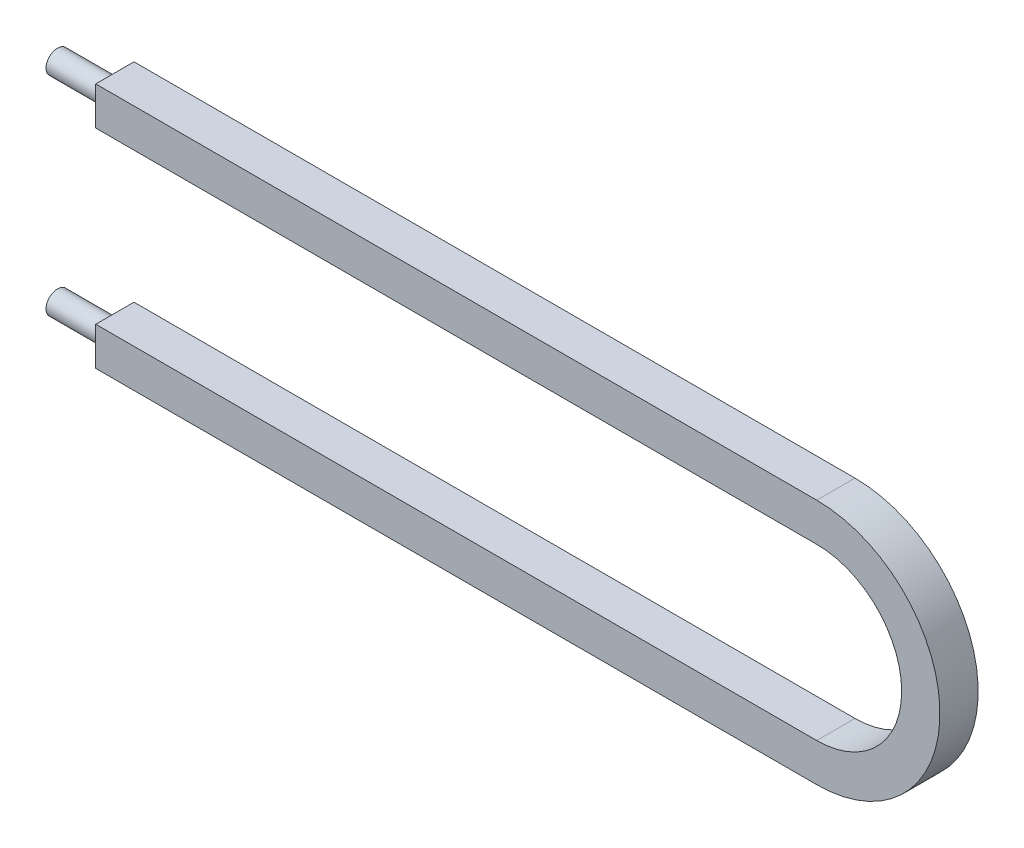
ISO-10303-21;
HEADER;
FILE_DESCRIPTION(('STEP AP214'),'2;1');
FILE_NAME('part.step','',(''),(''),'','','');
FILE_SCHEMA(('AUTOMOTIVE_DESIGN { 1 0 10303 214 1 1 1 1 }'));
ENDSEC;
DATA;
#1=APPLICATION_CONTEXT('core data for automotive mechanical design processes');
#2=APPLICATION_PROTOCOL_DEFINITION('international standard','automotive_design',2000,#1);
#3=PRODUCT_CONTEXT('',#1,'mechanical');
#4=PRODUCT('Part','Part','',(#3));
#5=PRODUCT_RELATED_PRODUCT_CATEGORY('part','',(#4));
#6=PRODUCT_DEFINITION_FORMATION('','',#4);
#7=PRODUCT_DEFINITION_CONTEXT('part definition',#1,'design');
#8=PRODUCT_DEFINITION('design','',#6,#7);
#9=PRODUCT_DEFINITION_SHAPE('','',#8);
#10=(LENGTH_UNIT() NAMED_UNIT(*) SI_UNIT(.MILLI.,.METRE.));
#11=(NAMED_UNIT(*) PLANE_ANGLE_UNIT() SI_UNIT($,.RADIAN.));
#12=(NAMED_UNIT(*) SI_UNIT($,.STERADIAN.) SOLID_ANGLE_UNIT());
#13=UNCERTAINTY_MEASURE_WITH_UNIT(LENGTH_MEASURE(1.E-05),#10,'distance_accuracy_value','');
#14=(GEOMETRIC_REPRESENTATION_CONTEXT(3) GLOBAL_UNCERTAINTY_ASSIGNED_CONTEXT((#13)) GLOBAL_UNIT_ASSIGNED_CONTEXT((#10,
#11,#12)) REPRESENTATION_CONTEXT('',''));
#15=CARTESIAN_POINT('',(0.,0.,0.));
#16=DIRECTION('',(0.,0.,1.));
#17=DIRECTION('',(1.,0.,0.));
#18=AXIS2_PLACEMENT_3D('',#15,#16,#17);
#19=CARTESIAN_POINT('',(0.,-10.,10.));
#20=DIRECTION('',(1.,0.,0.));
#21=DIRECTION('',(0.,0.,-1.));
#22=AXIS2_PLACEMENT_3D('',#19,#20,#21);
#23=PLANE('',#22);
#24=CARTESIAN_POINT('',(0.,-4.90697990871341,5.));
#25=DIRECTION('',(1.,0.,0.));
#26=DIRECTION('',(0.,0.,-1.));
#27=AXIS2_PLACEMENT_3D('',#24,#25,#26);
#28=CIRCLE('',#27,3.);
#29=CARTESIAN_POINT('',(0.,-4.90697990871341,2.));
#30=VERTEX_POINT('',#29);
#31=EDGE_CURVE('E45',#30,#30,#28,.F.);
#32=ORIENTED_EDGE('',*,*,#31,.F.);
#33=EDGE_LOOP('',(#32));
#34=FACE_BOUND('',#33,.T.);
#35=DIRECTION('',(0.,-1.,0.));
#36=VECTOR('',#35,1.);
#37=CARTESIAN_POINT('',(0.,-10.,0.));
#38=LINE('',#37,#36);
#39=CARTESIAN_POINT('',(0.,0.,0.));
#40=VERTEX_POINT('',#39);
#41=CARTESIAN_POINT('',(0.,-10.,0.));
#42=VERTEX_POINT('',#41);
#43=EDGE_CURVE('E134',#40,#42,#38,.T.);
#44=ORIENTED_EDGE('',*,*,#43,.T.);
#45=DIRECTION('',(0.,0.,-1.));
#46=VECTOR('',#45,1.);
#47=CARTESIAN_POINT('',(0.,-10.,10.));
#48=LINE('',#47,#46);
#49=CARTESIAN_POINT('',(0.,-10.,10.));
#50=VERTEX_POINT('',#49);
#51=EDGE_CURVE('E162',#50,#42,#48,.T.);
#52=ORIENTED_EDGE('',*,*,#51,.F.);
#53=DIRECTION('',(0.,-1.,0.));
#54=VECTOR('',#53,1.);
#55=CARTESIAN_POINT('',(0.,-10.,10.));
#56=LINE('',#55,#54);
#57=CARTESIAN_POINT('',(0.,0.,10.));
#58=VERTEX_POINT('',#57);
#59=EDGE_CURVE('E149',#58,#50,#56,.T.);
#60=ORIENTED_EDGE('',*,*,#59,.F.);
#61=DIRECTION('',(0.,0.,-1.));
#62=VECTOR('',#61,1.);
#63=CARTESIAN_POINT('',(0.,0.,10.));
#64=LINE('',#63,#62);
#65=EDGE_CURVE('E130',#58,#40,#64,.T.);
#66=ORIENTED_EDGE('',*,*,#65,.T.);
#67=EDGE_LOOP('',(#44,#52,#60,#66));
#68=FACE_BOUND('',#67,.T.);
#69=ADVANCED_FACE('F37',(#34,#68),#23,.F.);
#70=CARTESIAN_POINT('',(0.,-10.,10.));
#71=DIRECTION('',(0.,1.,0.));
#72=DIRECTION('',(0.,0.,1.));
#73=AXIS2_PLACEMENT_3D('',#70,#71,#72);
#74=PLANE('',#73);
#75=DIRECTION('',(1.,0.,0.));
#76=VECTOR('',#75,1.);
#77=CARTESIAN_POINT('',(0.,-10.,0.));
#78=LINE('',#77,#76);
#79=CARTESIAN_POINT('',(188.467924538912,-10.,0.));
#80=VERTEX_POINT('',#79);
#81=EDGE_CURVE('E137',#42,#80,#78,.T.);
#82=ORIENTED_EDGE('',*,*,#81,.T.);
#83=DIRECTION('',(0.,0.,-1.));
#84=VECTOR('',#83,1.);
#85=CARTESIAN_POINT('',(188.467924538912,-10.,10.));
#86=LINE('',#85,#84);
#87=CARTESIAN_POINT('',(188.467924538912,-10.,10.));
#88=VERTEX_POINT('',#87);
#89=EDGE_CURVE('E159',#88,#80,#86,.T.);
#90=ORIENTED_EDGE('',*,*,#89,.F.);
#91=DIRECTION('',(1.,0.,0.));
#92=VECTOR('',#91,1.);
#93=CARTESIAN_POINT('',(0.,-10.,10.));
#94=LINE('',#93,#92);
#95=EDGE_CURVE('E97',#50,#88,#94,.T.);
#96=ORIENTED_EDGE('',*,*,#95,.F.);
#97=ORIENTED_EDGE('',*,*,#51,.T.);
#98=EDGE_LOOP('',(#82,#90,#96,#97));
#99=FACE_BOUND('',#98,.T.);
#100=ADVANCED_FACE('F170',(#99),#74,.F.);
#101=CARTESIAN_POINT('',(188.467924538912,-32.2048422230386,10.));
#102=DIRECTION('',(0.,0.,-1.));
#103=DIRECTION('',(-1.,0.,0.));
#104=AXIS2_PLACEMENT_3D('',#101,#102,#103);
#105=CYLINDRICAL_SURFACE('',#104,22.2048422230386);
#106=CARTESIAN_POINT('',(188.467924538912,-32.2048422230386,0.));
#107=DIRECTION('',(0.,0.,-1.));
#108=DIRECTION('',(-1.,0.,0.));
#109=AXIS2_PLACEMENT_3D('',#106,#107,#108);
#110=CIRCLE('',#109,22.2048422230386);
#111=CARTESIAN_POINT('',(188.467924538912,-54.4096844460773,0.));
#112=VERTEX_POINT('',#111);
#113=EDGE_CURVE('E140',#80,#112,#110,.T.);
#114=ORIENTED_EDGE('',*,*,#113,.T.);
#115=DIRECTION('',(0.,0.,-1.));
#116=VECTOR('',#115,1.);
#117=CARTESIAN_POINT('',(188.467924538912,-54.4096844460773,10.));
#118=LINE('',#117,#116);
#119=CARTESIAN_POINT('',(188.467924538912,-54.4096844460773,10.));
#120=VERTEX_POINT('',#119);
#121=EDGE_CURVE('E156',#120,#112,#118,.T.);
#122=ORIENTED_EDGE('',*,*,#121,.F.);
#123=CARTESIAN_POINT('',(188.467924538912,-32.2048422230386,10.));
#124=DIRECTION('',(0.,0.,-1.));
#125=DIRECTION('',(-1.,0.,0.));
#126=AXIS2_PLACEMENT_3D('',#123,#124,#125);
#127=CIRCLE('',#126,22.2048422230386);
#128=EDGE_CURVE('E230',#88,#120,#127,.T.);
#129=ORIENTED_EDGE('',*,*,#128,.F.);
#130=ORIENTED_EDGE('',*,*,#89,.T.);
#131=EDGE_LOOP('',(#114,#122,#129,#130));
#132=FACE_BOUND('',#131,.T.);
#133=ADVANCED_FACE('F179',(#132),#105,.F.);
#134=CARTESIAN_POINT('',(188.467924538912,-54.4096844460773,10.));
#135=DIRECTION('',(0.,-1.,0.));
#136=DIRECTION('',(0.,0.,-1.));
#137=AXIS2_PLACEMENT_3D('',#134,#135,#136);
#138=PLANE('',#137);
#139=DIRECTION('',(-1.,0.,0.));
#140=VECTOR('',#139,1.);
#141=CARTESIAN_POINT('',(188.467924538912,-54.4096844460773,0.));
#142=LINE('',#141,#140);
#143=CARTESIAN_POINT('',(0.,-54.4096844460773,0.));
#144=VERTEX_POINT('',#143);
#145=EDGE_CURVE('E142',#112,#144,#142,.T.);
#146=ORIENTED_EDGE('',*,*,#145,.T.);
#147=DIRECTION('',(0.,0.,-1.));
#148=VECTOR('',#147,1.);
#149=CARTESIAN_POINT('',(0.,-54.4096844460773,10.));
#150=LINE('',#149,#148);
#151=CARTESIAN_POINT('',(0.,-54.4096844460773,10.));
#152=VERTEX_POINT('',#151);
#153=EDGE_CURVE('E153',#152,#144,#150,.T.);
#154=ORIENTED_EDGE('',*,*,#153,.F.);
#155=DIRECTION('',(-1.,0.,0.));
#156=VECTOR('',#155,1.);
#157=CARTESIAN_POINT('',(188.467924538912,-54.4096844460773,10.));
#158=LINE('',#157,#156);
#159=EDGE_CURVE('E232',#120,#152,#158,.T.);
#160=ORIENTED_EDGE('',*,*,#159,.F.);
#161=ORIENTED_EDGE('',*,*,#121,.T.);
#162=EDGE_LOOP('',(#146,#154,#160,#161));
#163=FACE_BOUND('',#162,.T.);
#164=ADVANCED_FACE('F183',(#163),#138,.F.);
#165=CARTESIAN_POINT('',(0.,-54.4096844460773,10.));
#166=DIRECTION('',(1.,0.,0.));
#167=DIRECTION('',(0.,0.,-1.));
#168=AXIS2_PLACEMENT_3D('',#165,#166,#167);
#169=PLANE('',#168);
#170=CARTESIAN_POINT('',(0.,-59.4096844460773,5.));
#171=DIRECTION('',(1.,0.,0.));
#172=DIRECTION('',(0.,0.,-1.));
#173=AXIS2_PLACEMENT_3D('',#170,#171,#172);
#174=CIRCLE('',#173,3.);
#175=CARTESIAN_POINT('',(0.,-59.4096844460773,2.));
#176=VERTEX_POINT('',#175);
#177=EDGE_CURVE('E11',#176,#176,#174,.F.);
#178=ORIENTED_EDGE('',*,*,#177,.F.);
#179=EDGE_LOOP('',(#178));
#180=FACE_BOUND('',#179,.T.);
#181=DIRECTION('',(0.,-1.,0.));
#182=VECTOR('',#181,1.);
#183=CARTESIAN_POINT('',(0.,-54.4096844460773,0.));
#184=LINE('',#183,#182);
#185=CARTESIAN_POINT('',(0.,-64.4096844460773,0.));
#186=VERTEX_POINT('',#185);
#187=EDGE_CURVE('E144',#144,#186,#184,.T.);
#188=ORIENTED_EDGE('',*,*,#187,.T.);
#189=DIRECTION('',(0.,0.,-1.));
#190=VECTOR('',#189,1.);
#191=CARTESIAN_POINT('',(0.,-64.4096844460773,10.));
#192=LINE('',#191,#190);
#193=CARTESIAN_POINT('',(0.,-64.4096844460773,10.));
#194=VERTEX_POINT('',#193);
#195=EDGE_CURVE('E125',#194,#186,#192,.T.);
#196=ORIENTED_EDGE('',*,*,#195,.F.);
#197=DIRECTION('',(0.,-1.,0.));
#198=VECTOR('',#197,1.);
#199=CARTESIAN_POINT('',(0.,-54.4096844460773,10.));
#200=LINE('',#199,#198);
#201=EDGE_CURVE('E116',#152,#194,#200,.T.);
#202=ORIENTED_EDGE('',*,*,#201,.F.);
#203=ORIENTED_EDGE('',*,*,#153,.T.);
#204=EDGE_LOOP('',(#188,#196,#202,#203));
#205=FACE_BOUND('',#204,.T.);
#206=ADVANCED_FACE('F189',(#180,#205),#169,.F.);
#207=CARTESIAN_POINT('',(188.467924538912,-64.4096844460773,10.));
#208=DIRECTION('',(0.,1.,0.));
#209=DIRECTION('',(0.,0.,1.));
#210=AXIS2_PLACEMENT_3D('',#207,#208,#209);
#211=PLANE('',#210);
#212=DIRECTION('',(1.,0.,0.));
#213=VECTOR('',#212,1.);
#214=CARTESIAN_POINT('',(188.467924538912,-64.4096844460773,0.));
#215=LINE('',#214,#213);
#216=CARTESIAN_POINT('',(188.467924538912,-64.4096844460773,0.));
#217=VERTEX_POINT('',#216);
#218=EDGE_CURVE('E124',#186,#217,#215,.T.);
#219=ORIENTED_EDGE('',*,*,#218,.T.);
#220=DIRECTION('',(0.,0.,-1.));
#221=VECTOR('',#220,1.);
#222=CARTESIAN_POINT('',(188.467924538912,-64.4096844460773,10.));
#223=LINE('',#222,#221);
#224=CARTESIAN_POINT('',(188.467924538912,-64.4096844460773,10.));
#225=VERTEX_POINT('',#224);
#226=EDGE_CURVE('E121',#225,#217,#223,.T.);
#227=ORIENTED_EDGE('',*,*,#226,.F.);
#228=DIRECTION('',(1.,0.,0.));
#229=VECTOR('',#228,1.);
#230=CARTESIAN_POINT('',(188.467924538912,-64.4096844460773,10.));
#231=LINE('',#230,#229);
#232=EDGE_CURVE('E110',#194,#225,#231,.T.);
#233=ORIENTED_EDGE('',*,*,#232,.F.);
#234=ORIENTED_EDGE('',*,*,#195,.T.);
#235=EDGE_LOOP('',(#219,#227,#233,#234));
#236=FACE_BOUND('',#235,.T.);
#237=ADVANCED_FACE('F122',(#236),#211,.F.);
#238=CARTESIAN_POINT('',(188.467924538912,-32.2048422230386,10.));
#239=DIRECTION('',(0.,0.,-1.));
#240=DIRECTION('',(-1.,0.,0.));
#241=AXIS2_PLACEMENT_3D('',#238,#239,#240);
#242=CYLINDRICAL_SURFACE('',#241,32.2048422230386);
#243=CARTESIAN_POINT('',(188.467924538912,-32.2048422230386,0.));
#244=DIRECTION('',(0.,0.,1.));
#245=DIRECTION('',(-1.,0.,0.));
#246=AXIS2_PLACEMENT_3D('',#243,#244,#245);
#247=CIRCLE('',#246,32.2048422230386);
#248=CARTESIAN_POINT('',(188.467924538912,0.,0.));
#249=VERTEX_POINT('',#248);
#250=EDGE_CURVE('E82',#217,#249,#247,.T.);
#251=ORIENTED_EDGE('',*,*,#250,.T.);
#252=DIRECTION('',(0.,0.,-1.));
#253=VECTOR('',#252,1.);
#254=CARTESIAN_POINT('',(188.467924538912,0.,10.));
#255=LINE('',#254,#253);
#256=CARTESIAN_POINT('',(188.467924538912,0.,10.));
#257=VERTEX_POINT('',#256);
#258=EDGE_CURVE('E126',#257,#249,#255,.T.);
#259=ORIENTED_EDGE('',*,*,#258,.F.);
#260=CARTESIAN_POINT('',(188.467924538912,-32.2048422230386,10.));
#261=DIRECTION('',(0.,0.,1.));
#262=DIRECTION('',(-1.,0.,0.));
#263=AXIS2_PLACEMENT_3D('',#260,#261,#262);
#264=CIRCLE('',#263,32.2048422230386);
#265=EDGE_CURVE('E114',#225,#257,#264,.T.);
#266=ORIENTED_EDGE('',*,*,#265,.F.);
#267=ORIENTED_EDGE('',*,*,#226,.T.);
#268=EDGE_LOOP('',(#251,#259,#266,#267));
#269=FACE_BOUND('',#268,.T.);
#270=ADVANCED_FACE('F128',(#269),#242,.T.);
#271=CARTESIAN_POINT('',(0.,0.,10.));
#272=DIRECTION('',(0.,-1.,0.));
#273=DIRECTION('',(0.,0.,-1.));
#274=AXIS2_PLACEMENT_3D('',#271,#272,#273);
#275=PLANE('',#274);
#276=DIRECTION('',(-1.,0.,0.));
#277=VECTOR('',#276,1.);
#278=CARTESIAN_POINT('',(0.,0.,0.));
#279=LINE('',#278,#277);
#280=EDGE_CURVE('E88',#249,#40,#279,.T.);
#281=ORIENTED_EDGE('',*,*,#280,.T.);
#282=ORIENTED_EDGE('',*,*,#65,.F.);
#283=DIRECTION('',(-1.,0.,0.));
#284=VECTOR('',#283,1.);
#285=CARTESIAN_POINT('',(0.,0.,10.));
#286=LINE('',#285,#284);
#287=EDGE_CURVE('E53',#257,#58,#286,.T.);
#288=ORIENTED_EDGE('',*,*,#287,.F.);
#289=ORIENTED_EDGE('',*,*,#258,.T.);
#290=EDGE_LOOP('',(#281,#282,#288,#289));
#291=FACE_BOUND('',#290,.T.);
#292=ADVANCED_FACE('F198',(#291),#275,.F.);
#293=CARTESIAN_POINT('',(188.467924538912,-32.2048422230386,10.));
#294=DIRECTION('',(0.,0.,-1.));
#295=DIRECTION('',(-1.,0.,0.));
#296=AXIS2_PLACEMENT_3D('',#293,#294,#295);
#297=PLANE('',#296);
#298=ORIENTED_EDGE('',*,*,#59,.T.);
#299=ORIENTED_EDGE('',*,*,#95,.T.);
#300=ORIENTED_EDGE('',*,*,#128,.T.);
#301=ORIENTED_EDGE('',*,*,#159,.T.);
#302=ORIENTED_EDGE('',*,*,#201,.T.);
#303=ORIENTED_EDGE('',*,*,#232,.T.);
#304=ORIENTED_EDGE('',*,*,#265,.T.);
#305=ORIENTED_EDGE('',*,*,#287,.T.);
#306=EDGE_LOOP('',(#298,#299,#300,#301,#302,#303,#304,#305));
#307=FACE_BOUND('',#306,.T.);
#308=ADVANCED_FACE('F112',(#307),#297,.F.);
#309=CARTESIAN_POINT('',(188.467924538912,-32.2048422230386,0.));
#310=DIRECTION('',(0.,0.,-1.));
#311=DIRECTION('',(-1.,0.,0.));
#312=AXIS2_PLACEMENT_3D('',#309,#310,#311);
#313=PLANE('',#312);
#314=ORIENTED_EDGE('',*,*,#43,.F.);
#315=ORIENTED_EDGE('',*,*,#280,.F.);
#316=ORIENTED_EDGE('',*,*,#250,.F.);
#317=ORIENTED_EDGE('',*,*,#218,.F.);
#318=ORIENTED_EDGE('',*,*,#187,.F.);
#319=ORIENTED_EDGE('',*,*,#145,.F.);
#320=ORIENTED_EDGE('',*,*,#113,.F.);
#321=ORIENTED_EDGE('',*,*,#81,.F.);
#322=EDGE_LOOP('',(#314,#315,#316,#317,#318,#319,#320,#321));
#323=FACE_BOUND('',#322,.T.);
#324=ADVANCED_FACE('F175',(#323),#313,.T.);
#325=CARTESIAN_POINT('',(-15.,-4.90697990871341,5.));
#326=DIRECTION('',(1.,0.,0.));
#327=DIRECTION('',(0.,0.,-1.));
#328=AXIS2_PLACEMENT_3D('',#325,#326,#327);
#329=CYLINDRICAL_SURFACE('',#328,3.);
#330=CARTESIAN_POINT('',(-15.,-4.90697990871341,5.));
#331=DIRECTION('',(-1.,0.,0.));
#332=DIRECTION('',(0.,0.,1.));
#333=AXIS2_PLACEMENT_3D('',#330,#331,#332);
#334=CIRCLE('',#333,3.);
#335=CARTESIAN_POINT('',(-15.,-4.90697990871341,8.));
#336=VERTEX_POINT('',#335);
#337=EDGE_CURVE('E138',#336,#336,#334,.T.);
#338=ORIENTED_EDGE('',*,*,#337,.F.);
#339=EDGE_LOOP('',(#338));
#340=FACE_BOUND('',#339,.T.);
#341=ORIENTED_EDGE('',*,*,#31,.T.);
#342=EDGE_LOOP('',(#341));
#343=FACE_BOUND('',#342,.T.);
#344=ADVANCED_FACE('F166',(#340,#343),#329,.T.);
#345=CARTESIAN_POINT('',(-15.,-4.90697990871341,5.));
#346=DIRECTION('',(-1.,0.,0.));
#347=DIRECTION('',(0.,0.,1.));
#348=AXIS2_PLACEMENT_3D('',#345,#346,#347);
#349=PLANE('',#348);
#350=ORIENTED_EDGE('',*,*,#337,.T.);
#351=EDGE_LOOP('',(#350));
#352=FACE_BOUND('',#351,.T.);
#353=ADVANCED_FACE('F207',(#352),#349,.T.);
#354=CARTESIAN_POINT('',(-15.,-59.4096844460773,5.));
#355=DIRECTION('',(1.,0.,0.));
#356=DIRECTION('',(0.,0.,-1.));
#357=AXIS2_PLACEMENT_3D('',#354,#355,#356);
#358=CYLINDRICAL_SURFACE('',#357,3.);
#359=CARTESIAN_POINT('',(-15.,-59.4096844460773,5.));
#360=DIRECTION('',(-1.,0.,0.));
#361=DIRECTION('',(0.,0.,1.));
#362=AXIS2_PLACEMENT_3D('',#359,#360,#361);
#363=CIRCLE('',#362,3.);
#364=CARTESIAN_POINT('',(-15.,-59.4096844460773,8.));
#365=VERTEX_POINT('',#364);
#366=EDGE_CURVE('E223',#365,#365,#363,.T.);
#367=ORIENTED_EDGE('',*,*,#366,.F.);
#368=EDGE_LOOP('',(#367));
#369=FACE_BOUND('',#368,.T.);
#370=ORIENTED_EDGE('',*,*,#177,.T.);
#371=EDGE_LOOP('',(#370));
#372=FACE_BOUND('',#371,.T.);
#373=ADVANCED_FACE('F211',(#369,#372),#358,.T.);
#374=CARTESIAN_POINT('',(-15.,-59.4096844460773,5.));
#375=DIRECTION('',(-1.,0.,0.));
#376=DIRECTION('',(0.,0.,1.));
#377=AXIS2_PLACEMENT_3D('',#374,#375,#376);
#378=PLANE('',#377);
#379=ORIENTED_EDGE('',*,*,#366,.T.);
#380=EDGE_LOOP('',(#379));
#381=FACE_BOUND('',#380,.T.);
#382=ADVANCED_FACE('F215',(#381),#378,.T.);
#383=CLOSED_SHELL('',(#69,#100,#133,#164,#206,#237,#270,#292,#308,#324,#344,#353,#373,#382));
#384=MANIFOLD_SOLID_BREP('B2',#383);
#385=ADVANCED_BREP_SHAPE_REPRESENTATION('',(#18,#384),#14);
#386=SHAPE_DEFINITION_REPRESENTATION(#9,#385);
ENDSEC;
END-ISO-10303-21;
